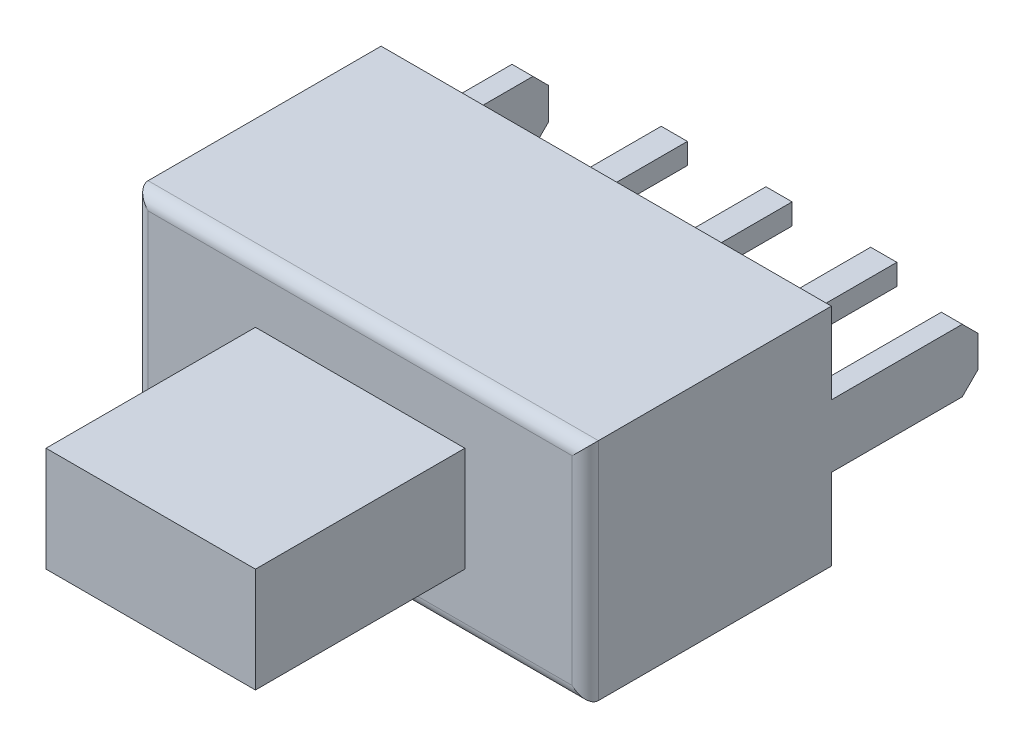
ISO-10303-21;
HEADER;
FILE_DESCRIPTION(('STEP AP214'),'2;1');
FILE_NAME('part.step','',(''),(''),'','','');
FILE_SCHEMA(('AUTOMOTIVE_DESIGN { 1 0 10303 214 1 1 1 1 }'));
ENDSEC;
DATA;
#1=APPLICATION_CONTEXT('core data for automotive mechanical design processes');
#2=APPLICATION_PROTOCOL_DEFINITION('international standard','automotive_design',2000,#1);
#3=PRODUCT_CONTEXT('',#1,'mechanical');
#4=PRODUCT('Part','Part','',(#3));
#5=PRODUCT_RELATED_PRODUCT_CATEGORY('part','',(#4));
#6=PRODUCT_DEFINITION_FORMATION('','',#4);
#7=PRODUCT_DEFINITION_CONTEXT('part definition',#1,'design');
#8=PRODUCT_DEFINITION('design','',#6,#7);
#9=PRODUCT_DEFINITION_SHAPE('','',#8);
#10=(LENGTH_UNIT() NAMED_UNIT(*) SI_UNIT(.MILLI.,.METRE.));
#11=(NAMED_UNIT(*) PLANE_ANGLE_UNIT() SI_UNIT($,.RADIAN.));
#12=(NAMED_UNIT(*) SI_UNIT($,.STERADIAN.) SOLID_ANGLE_UNIT());
#13=UNCERTAINTY_MEASURE_WITH_UNIT(LENGTH_MEASURE(1.E-05),#10,'distance_accuracy_value','');
#14=(GEOMETRIC_REPRESENTATION_CONTEXT(3) GLOBAL_UNCERTAINTY_ASSIGNED_CONTEXT((#13)) GLOBAL_UNIT_ASSIGNED_CONTEXT((#10,
#11,#12)) REPRESENTATION_CONTEXT('',''));
#15=CARTESIAN_POINT('',(0.,0.,0.));
#16=DIRECTION('',(0.,0.,1.));
#17=DIRECTION('',(1.,0.,0.));
#18=AXIS2_PLACEMENT_3D('',#15,#16,#17);
#19=CARTESIAN_POINT('',(0.,0.,4.7));
#20=DIRECTION('',(0.,0.,-1.));
#21=DIRECTION('',(-1.,0.,0.));
#22=AXIS2_PLACEMENT_3D('',#19,#20,#21);
#23=PLANE('',#22);
#24=DIRECTION('',(0.,-1.,0.));
#25=VECTOR('',#24,1.);
#26=CARTESIAN_POINT('',(-4.05,0.,4.7));
#27=LINE('',#26,#25);
#28=CARTESIAN_POINT('',(-4.05,1.9,4.7));
#29=VERTEX_POINT('',#28);
#30=CARTESIAN_POINT('',(-4.05,-1.9,4.7));
#31=VERTEX_POINT('',#30);
#32=EDGE_CURVE('E505',#29,#31,#27,.T.);
#33=ORIENTED_EDGE('',*,*,#32,.T.);
#34=DIRECTION('',(1.,0.,0.));
#35=VECTOR('',#34,1.);
#36=CARTESIAN_POINT('',(0.,-1.9,4.7));
#37=LINE('',#36,#35);
#38=CARTESIAN_POINT('',(4.05,-1.9,4.7));
#39=VERTEX_POINT('',#38);
#40=EDGE_CURVE('E510',#31,#39,#37,.T.);
#41=ORIENTED_EDGE('',*,*,#40,.T.);
#42=DIRECTION('',(0.,1.,0.));
#43=VECTOR('',#42,1.);
#44=CARTESIAN_POINT('',(4.05,0.,4.7));
#45=LINE('',#44,#43);
#46=CARTESIAN_POINT('',(4.05,1.9,4.7));
#47=VERTEX_POINT('',#46);
#48=EDGE_CURVE('E507',#39,#47,#45,.T.);
#49=ORIENTED_EDGE('',*,*,#48,.T.);
#50=DIRECTION('',(-1.,0.,0.));
#51=VECTOR('',#50,1.);
#52=CARTESIAN_POINT('',(0.,1.9,4.7));
#53=LINE('',#52,#51);
#54=EDGE_CURVE('E503',#47,#29,#53,.T.);
#55=ORIENTED_EDGE('',*,*,#54,.T.);
#56=EDGE_LOOP('',(#33,#41,#49,#55));
#57=FACE_BOUND('',#56,.T.);
#58=DIRECTION('',(0.,1.,0.));
#59=VECTOR('',#58,1.);
#60=CARTESIAN_POINT('',(2.,-1.,4.7));
#61=LINE('',#60,#59);
#62=CARTESIAN_POINT('',(2.,-1.,4.7));
#63=VERTEX_POINT('',#62);
#64=CARTESIAN_POINT('',(2.,1.,4.7));
#65=VERTEX_POINT('',#64);
#66=EDGE_CURVE('E412',#63,#65,#61,.T.);
#67=ORIENTED_EDGE('',*,*,#66,.F.);
#68=DIRECTION('',(1.,0.,0.));
#69=VECTOR('',#68,1.);
#70=CARTESIAN_POINT('',(-2.,-1.,4.7));
#71=LINE('',#70,#69);
#72=CARTESIAN_POINT('',(-2.,-1.,4.7));
#73=VERTEX_POINT('',#72);
#74=EDGE_CURVE('E417',#73,#63,#71,.T.);
#75=ORIENTED_EDGE('',*,*,#74,.F.);
#76=DIRECTION('',(0.,-1.,0.));
#77=VECTOR('',#76,1.);
#78=CARTESIAN_POINT('',(-2.,-1.,4.7));
#79=LINE('',#78,#77);
#80=CARTESIAN_POINT('',(-2.,1.,4.7));
#81=VERTEX_POINT('',#80);
#82=EDGE_CURVE('E429',#81,#73,#79,.T.);
#83=ORIENTED_EDGE('',*,*,#82,.F.);
#84=DIRECTION('',(-1.,0.,0.));
#85=VECTOR('',#84,1.);
#86=CARTESIAN_POINT('',(-2.,1.,4.7));
#87=LINE('',#86,#85);
#88=EDGE_CURVE('E426',#65,#81,#87,.T.);
#89=ORIENTED_EDGE('',*,*,#88,.F.);
#90=EDGE_LOOP('',(#67,#75,#83,#89));
#91=FACE_BOUND('',#90,.T.);
#92=ADVANCED_FACE('F39',(#57,#91),#23,.F.);
#93=CARTESIAN_POINT('',(4.3,-2.15,4.7));
#94=DIRECTION('',(-1.,0.,0.));
#95=DIRECTION('',(0.,0.,1.));
#96=AXIS2_PLACEMENT_3D('',#93,#94,#95);
#97=PLANE('',#96);
#98=DIRECTION('',(0.,0.,-1.));
#99=VECTOR('',#98,1.);
#100=CARTESIAN_POINT('',(4.3,2.15,4.7));
#101=LINE('',#100,#99);
#102=CARTESIAN_POINT('',(4.3,2.15,4.45));
#103=VERTEX_POINT('',#102);
#104=CARTESIAN_POINT('',(4.3,2.15,0.));
#105=VERTEX_POINT('',#104);
#106=EDGE_CURVE('E465',#103,#105,#101,.T.);
#107=ORIENTED_EDGE('',*,*,#106,.F.);
#108=DIRECTION('',(0.,1.,0.));
#109=VECTOR('',#108,1.);
#110=CARTESIAN_POINT('',(4.3,-2.15,4.45));
#111=LINE('',#110,#109);
#112=CARTESIAN_POINT('',(4.3,-2.15,4.45));
#113=VERTEX_POINT('',#112);
#114=EDGE_CURVE('E512',#103,#113,#111,.F.);
#115=ORIENTED_EDGE('',*,*,#114,.T.);
#116=DIRECTION('',(0.,0.,-1.));
#117=VECTOR('',#116,1.);
#118=CARTESIAN_POINT('',(4.3,-2.15,4.7));
#119=LINE('',#118,#117);
#120=CARTESIAN_POINT('',(4.3,-2.15,0.));
#121=VERTEX_POINT('',#120);
#122=EDGE_CURVE('E459',#113,#121,#119,.T.);
#123=ORIENTED_EDGE('',*,*,#122,.T.);
#124=DIRECTION('',(0.,1.,0.));
#125=VECTOR('',#124,1.);
#126=CARTESIAN_POINT('',(4.3,-2.15,0.));
#127=LINE('',#126,#125);
#128=CARTESIAN_POINT('',(4.3,-0.6,0.));
#129=VERTEX_POINT('',#128);
#130=EDGE_CURVE('E446',#121,#129,#127,.T.);
#131=ORIENTED_EDGE('',*,*,#130,.T.);
#132=DIRECTION('',(0.,0.,1.));
#133=VECTOR('',#132,1.);
#134=CARTESIAN_POINT('',(4.3,-0.6,-2.8));
#135=LINE('',#134,#133);
#136=CARTESIAN_POINT('',(4.3,-0.6,-2.5));
#137=VERTEX_POINT('',#136);
#138=EDGE_CURVE('E406',#137,#129,#135,.T.);
#139=ORIENTED_EDGE('',*,*,#138,.F.);
#140=DIRECTION('',(0.,0.707106781186547,-0.707106781186547));
#141=VECTOR('',#140,1.);
#142=CARTESIAN_POINT('',(4.3,-0.3,-2.8));
#143=LINE('',#142,#141);
#144=CARTESIAN_POINT('',(4.3,-0.3,-2.8));
#145=VERTEX_POINT('',#144);
#146=EDGE_CURVE('E480',#137,#145,#143,.T.);
#147=ORIENTED_EDGE('',*,*,#146,.T.);
#148=DIRECTION('',(0.,-1.,0.));
#149=VECTOR('',#148,1.);
#150=CARTESIAN_POINT('',(4.3,0.,-2.8));
#151=LINE('',#150,#149);
#152=CARTESIAN_POINT('',(4.3,0.3,-2.8));
#153=VERTEX_POINT('',#152);
#154=EDGE_CURVE('E393',#153,#145,#151,.T.);
#155=ORIENTED_EDGE('',*,*,#154,.F.);
#156=DIRECTION('',(0.,-0.707106781186547,-0.707106781186547));
#157=VECTOR('',#156,1.);
#158=CARTESIAN_POINT('',(4.3,0.6,-2.5));
#159=LINE('',#158,#157);
#160=CARTESIAN_POINT('',(4.3,0.6,-2.5));
#161=VERTEX_POINT('',#160);
#162=EDGE_CURVE('E478',#153,#161,#159,.F.);
#163=ORIENTED_EDGE('',*,*,#162,.T.);
#164=DIRECTION('',(0.,0.,1.));
#165=VECTOR('',#164,1.);
#166=CARTESIAN_POINT('',(4.3,0.6,-2.8));
#167=LINE('',#166,#165);
#168=CARTESIAN_POINT('',(4.3,0.6,0.));
#169=VERTEX_POINT('',#168);
#170=EDGE_CURVE('E408',#161,#169,#167,.T.);
#171=ORIENTED_EDGE('',*,*,#170,.T.);
#172=EDGE_CURVE('E445',#169,#105,#127,.T.);
#173=ORIENTED_EDGE('',*,*,#172,.T.);
#174=EDGE_LOOP('',(#107,#115,#123,#131,#139,#147,#155,#163,#171,#173));
#175=FACE_BOUND('',#174,.T.);
#176=ADVANCED_FACE('F542',(#175),#97,.F.);
#177=CARTESIAN_POINT('',(-4.3,2.15,4.7));
#178=DIRECTION('',(0.,-1.,0.));
#179=DIRECTION('',(0.,0.,-1.));
#180=AXIS2_PLACEMENT_3D('',#177,#178,#179);
#181=PLANE('',#180);
#182=DIRECTION('',(0.,0.,-1.));
#183=VECTOR('',#182,1.);
#184=CARTESIAN_POINT('',(-4.3,2.15,4.7));
#185=LINE('',#184,#183);
#186=CARTESIAN_POINT('',(-4.3,2.15,4.45));
#187=VERTEX_POINT('',#186);
#188=CARTESIAN_POINT('',(-4.3,2.15,0.));
#189=VERTEX_POINT('',#188);
#190=EDGE_CURVE('E463',#187,#189,#185,.T.);
#191=ORIENTED_EDGE('',*,*,#190,.F.);
#192=DIRECTION('',(-1.,0.,0.));
#193=VECTOR('',#192,1.);
#194=CARTESIAN_POINT('',(-4.3,2.15,4.45));
#195=LINE('',#194,#193);
#196=EDGE_CURVE('E11',#187,#103,#195,.F.);
#197=ORIENTED_EDGE('',*,*,#196,.T.);
#198=ORIENTED_EDGE('',*,*,#106,.T.);
#199=DIRECTION('',(-1.,0.,0.));
#200=VECTOR('',#199,1.);
#201=CARTESIAN_POINT('',(-4.3,2.15,0.));
#202=LINE('',#201,#200);
#203=EDGE_CURVE('E449',#105,#189,#202,.T.);
#204=ORIENTED_EDGE('',*,*,#203,.T.);
#205=EDGE_LOOP('',(#191,#197,#198,#204));
#206=FACE_BOUND('',#205,.T.);
#207=ADVANCED_FACE('F538',(#206),#181,.F.);
#208=CARTESIAN_POINT('',(-4.3,-2.15,4.7));
#209=DIRECTION('',(1.,0.,0.));
#210=DIRECTION('',(0.,0.,-1.));
#211=AXIS2_PLACEMENT_3D('',#208,#209,#210);
#212=PLANE('',#211);
#213=DIRECTION('',(0.,0.,-1.));
#214=VECTOR('',#213,1.);
#215=CARTESIAN_POINT('',(-4.3,-2.15,4.7));
#216=LINE('',#215,#214);
#217=CARTESIAN_POINT('',(-4.3,-2.15,4.45));
#218=VERTEX_POINT('',#217);
#219=CARTESIAN_POINT('',(-4.3,-2.15,0.));
#220=VERTEX_POINT('',#219);
#221=EDGE_CURVE('E461',#218,#220,#216,.T.);
#222=ORIENTED_EDGE('',*,*,#221,.F.);
#223=DIRECTION('',(0.,-1.,0.));
#224=VECTOR('',#223,1.);
#225=CARTESIAN_POINT('',(-4.3,-2.15,4.45));
#226=LINE('',#225,#224);
#227=EDGE_CURVE('E56',#218,#187,#226,.F.);
#228=ORIENTED_EDGE('',*,*,#227,.T.);
#229=ORIENTED_EDGE('',*,*,#190,.T.);
#230=DIRECTION('',(0.,-1.,0.));
#231=VECTOR('',#230,1.);
#232=CARTESIAN_POINT('',(-4.3,-2.15,0.));
#233=LINE('',#232,#231);
#234=CARTESIAN_POINT('',(-4.3,0.6,0.));
#235=VERTEX_POINT('',#234);
#236=EDGE_CURVE('E453',#189,#235,#233,.T.);
#237=ORIENTED_EDGE('',*,*,#236,.T.);
#238=DIRECTION('',(0.,0.,1.));
#239=VECTOR('',#238,1.);
#240=CARTESIAN_POINT('',(-4.3,0.6,-2.8));
#241=LINE('',#240,#239);
#242=CARTESIAN_POINT('',(-4.3,0.6,-2.5));
#243=VERTEX_POINT('',#242);
#244=EDGE_CURVE('E374',#243,#235,#241,.T.);
#245=ORIENTED_EDGE('',*,*,#244,.F.);
#246=DIRECTION('',(0.,0.707106781186547,0.707106781186547));
#247=VECTOR('',#246,1.);
#248=CARTESIAN_POINT('',(-4.3,0.6,-2.5));
#249=LINE('',#248,#247);
#250=CARTESIAN_POINT('',(-4.3,0.3,-2.8));
#251=VERTEX_POINT('',#250);
#252=EDGE_CURVE('E487',#243,#251,#249,.F.);
#253=ORIENTED_EDGE('',*,*,#252,.T.);
#254=DIRECTION('',(0.,1.,0.));
#255=VECTOR('',#254,1.);
#256=CARTESIAN_POINT('',(-4.3,0.,-2.8));
#257=LINE('',#256,#255);
#258=CARTESIAN_POINT('',(-4.3,-0.3,-2.8));
#259=VERTEX_POINT('',#258);
#260=EDGE_CURVE('E370',#259,#251,#257,.T.);
#261=ORIENTED_EDGE('',*,*,#260,.F.);
#262=DIRECTION('',(0.,-0.707106781186547,0.707106781186547));
#263=VECTOR('',#262,1.);
#264=CARTESIAN_POINT('',(-4.3,-0.3,-2.8));
#265=LINE('',#264,#263);
#266=CARTESIAN_POINT('',(-4.3,-0.6,-2.5));
#267=VERTEX_POINT('',#266);
#268=EDGE_CURVE('E489',#259,#267,#265,.T.);
#269=ORIENTED_EDGE('',*,*,#268,.T.);
#270=DIRECTION('',(0.,0.,1.));
#271=VECTOR('',#270,1.);
#272=CARTESIAN_POINT('',(-4.3,-0.6,-2.8));
#273=LINE('',#272,#271);
#274=CARTESIAN_POINT('',(-4.3,-0.6,0.));
#275=VERTEX_POINT('',#274);
#276=EDGE_CURVE('E383',#267,#275,#273,.T.);
#277=ORIENTED_EDGE('',*,*,#276,.T.);
#278=EDGE_CURVE('E452',#275,#220,#233,.T.);
#279=ORIENTED_EDGE('',*,*,#278,.T.);
#280=EDGE_LOOP('',(#222,#228,#229,#237,#245,#253,#261,#269,#277,#279));
#281=FACE_BOUND('',#280,.T.);
#282=ADVANCED_FACE('F586',(#281),#212,.F.);
#283=CARTESIAN_POINT('',(-4.3,-2.15,4.7));
#284=DIRECTION('',(0.,1.,0.));
#285=DIRECTION('',(0.,0.,1.));
#286=AXIS2_PLACEMENT_3D('',#283,#284,#285);
#287=PLANE('',#286);
#288=ORIENTED_EDGE('',*,*,#122,.F.);
#289=DIRECTION('',(1.,0.,0.));
#290=VECTOR('',#289,1.);
#291=CARTESIAN_POINT('',(-4.3,-2.15,4.45));
#292=LINE('',#291,#290);
#293=EDGE_CURVE('E48',#113,#218,#292,.F.);
#294=ORIENTED_EDGE('',*,*,#293,.T.);
#295=ORIENTED_EDGE('',*,*,#221,.T.);
#296=DIRECTION('',(1.,0.,0.));
#297=VECTOR('',#296,1.);
#298=CARTESIAN_POINT('',(-4.3,-2.15,0.));
#299=LINE('',#298,#297);
#300=EDGE_CURVE('E456',#220,#121,#299,.T.);
#301=ORIENTED_EDGE('',*,*,#300,.T.);
#302=EDGE_LOOP('',(#288,#294,#295,#301));
#303=FACE_BOUND('',#302,.T.);
#304=ADVANCED_FACE('F582',(#303),#287,.F.);
#305=CARTESIAN_POINT('',(0.,0.,0.));
#306=DIRECTION('',(0.,0.,-1.));
#307=DIRECTION('',(-1.,0.,0.));
#308=AXIS2_PLACEMENT_3D('',#305,#306,#307);
#309=PLANE('',#308);
#310=DIRECTION('',(0.,-1.,0.));
#311=VECTOR('',#310,1.);
#312=CARTESIAN_POINT('',(1.75,0.,0.));
#313=LINE('',#312,#311);
#314=CARTESIAN_POINT('',(1.75,0.2,0.));
#315=VERTEX_POINT('',#314);
#316=CARTESIAN_POINT('',(1.75,-0.2,0.));
#317=VERTEX_POINT('',#316);
#318=EDGE_CURVE('E266',#315,#317,#313,.T.);
#319=ORIENTED_EDGE('',*,*,#318,.T.);
#320=DIRECTION('',(-1.,0.,0.));
#321=VECTOR('',#320,1.);
#322=CARTESIAN_POINT('',(0.,-0.2,0.));
#323=LINE('',#322,#321);
#324=CARTESIAN_POINT('',(2.25,-0.2,0.));
#325=VERTEX_POINT('',#324);
#326=EDGE_CURVE('E281',#325,#317,#323,.T.);
#327=ORIENTED_EDGE('',*,*,#326,.F.);
#328=DIRECTION('',(0.,-1.,0.));
#329=VECTOR('',#328,1.);
#330=CARTESIAN_POINT('',(2.25,0.,0.));
#331=LINE('',#330,#329);
#332=CARTESIAN_POINT('',(2.25,0.2,0.));
#333=VERTEX_POINT('',#332);
#334=EDGE_CURVE('E294',#333,#325,#331,.T.);
#335=ORIENTED_EDGE('',*,*,#334,.F.);
#336=DIRECTION('',(-1.,0.,0.));
#337=VECTOR('',#336,1.);
#338=CARTESIAN_POINT('',(0.,0.2,0.));
#339=LINE('',#338,#337);
#340=EDGE_CURVE('E292',#333,#315,#339,.T.);
#341=ORIENTED_EDGE('',*,*,#340,.T.);
#342=EDGE_LOOP('',(#319,#327,#335,#341));
#343=FACE_BOUND('',#342,.T.);
#344=DIRECTION('',(-1.,0.,0.));
#345=VECTOR('',#344,1.);
#346=CARTESIAN_POINT('',(0.,0.2,0.));
#347=LINE('',#346,#345);
#348=CARTESIAN_POINT('',(0.25,0.2,0.));
#349=VERTEX_POINT('',#348);
#350=CARTESIAN_POINT('',(-0.25,0.2,0.));
#351=VERTEX_POINT('',#350);
#352=EDGE_CURVE('E271',#349,#351,#347,.T.);
#353=ORIENTED_EDGE('',*,*,#352,.T.);
#354=DIRECTION('',(0.,-1.,0.));
#355=VECTOR('',#354,1.);
#356=CARTESIAN_POINT('',(-0.25,0.,0.));
#357=LINE('',#356,#355);
#358=CARTESIAN_POINT('',(-0.25,-0.2,0.));
#359=VERTEX_POINT('',#358);
#360=EDGE_CURVE('E307',#351,#359,#357,.T.);
#361=ORIENTED_EDGE('',*,*,#360,.T.);
#362=DIRECTION('',(-1.,0.,0.));
#363=VECTOR('',#362,1.);
#364=CARTESIAN_POINT('',(0.,-0.2,0.));
#365=LINE('',#364,#363);
#366=CARTESIAN_POINT('',(0.25,-0.2,0.));
#367=VERTEX_POINT('',#366);
#368=EDGE_CURVE('E319',#367,#359,#365,.T.);
#369=ORIENTED_EDGE('',*,*,#368,.F.);
#370=DIRECTION('',(0.,-1.,0.));
#371=VECTOR('',#370,1.);
#372=CARTESIAN_POINT('',(0.25,0.,0.));
#373=LINE('',#372,#371);
#374=EDGE_CURVE('E316',#349,#367,#373,.T.);
#375=ORIENTED_EDGE('',*,*,#374,.F.);
#376=EDGE_LOOP('',(#353,#361,#369,#375));
#377=FACE_BOUND('',#376,.T.);
#378=DIRECTION('',(-1.,0.,0.));
#379=VECTOR('',#378,1.);
#380=CARTESIAN_POINT('',(0.,0.2,0.));
#381=LINE('',#380,#379);
#382=CARTESIAN_POINT('',(-1.75,0.2,0.));
#383=VERTEX_POINT('',#382);
#384=CARTESIAN_POINT('',(-2.25,0.2,0.));
#385=VERTEX_POINT('',#384);
#386=EDGE_CURVE('E334',#383,#385,#381,.T.);
#387=ORIENTED_EDGE('',*,*,#386,.T.);
#388=DIRECTION('',(0.,-1.,0.));
#389=VECTOR('',#388,1.);
#390=CARTESIAN_POINT('',(-2.25,0.,0.));
#391=LINE('',#390,#389);
#392=CARTESIAN_POINT('',(-2.25,-0.2,0.));
#393=VERTEX_POINT('',#392);
#394=EDGE_CURVE('E339',#385,#393,#391,.T.);
#395=ORIENTED_EDGE('',*,*,#394,.T.);
#396=DIRECTION('',(-1.,0.,0.));
#397=VECTOR('',#396,1.);
#398=CARTESIAN_POINT('',(0.,-0.2,0.));
#399=LINE('',#398,#397);
#400=CARTESIAN_POINT('',(-1.75,-0.2,0.));
#401=VERTEX_POINT('',#400);
#402=EDGE_CURVE('E351',#401,#393,#399,.T.);
#403=ORIENTED_EDGE('',*,*,#402,.F.);
#404=DIRECTION('',(0.,-1.,0.));
#405=VECTOR('',#404,1.);
#406=CARTESIAN_POINT('',(-1.75,0.,0.));
#407=LINE('',#406,#405);
#408=EDGE_CURVE('E348',#383,#401,#407,.T.);
#409=ORIENTED_EDGE('',*,*,#408,.F.);
#410=EDGE_LOOP('',(#387,#395,#403,#409));
#411=FACE_BOUND('',#410,.T.);
#412=DIRECTION('',(-1.,0.,0.));
#413=VECTOR('',#412,1.);
#414=CARTESIAN_POINT('',(0.,0.6,0.));
#415=LINE('',#414,#413);
#416=CARTESIAN_POINT('',(-3.9,0.6,0.));
#417=VERTEX_POINT('',#416);
#418=EDGE_CURVE('E366',#417,#235,#415,.T.);
#419=ORIENTED_EDGE('',*,*,#418,.T.);
#420=ORIENTED_EDGE('',*,*,#236,.F.);
#421=ORIENTED_EDGE('',*,*,#203,.F.);
#422=ORIENTED_EDGE('',*,*,#172,.F.);
#423=DIRECTION('',(-1.,0.,0.));
#424=VECTOR('',#423,1.);
#425=CARTESIAN_POINT('',(0.,0.6,0.));
#426=LINE('',#425,#424);
#427=CARTESIAN_POINT('',(3.9,0.6,0.));
#428=VERTEX_POINT('',#427);
#429=EDGE_CURVE('E400',#169,#428,#426,.T.);
#430=ORIENTED_EDGE('',*,*,#429,.T.);
#431=DIRECTION('',(0.,-1.,0.));
#432=VECTOR('',#431,1.);
#433=CARTESIAN_POINT('',(3.9,0.,0.));
#434=LINE('',#433,#432);
#435=CARTESIAN_POINT('',(3.9,-0.6,0.));
#436=VERTEX_POINT('',#435);
#437=EDGE_CURVE('E389',#428,#436,#434,.T.);
#438=ORIENTED_EDGE('',*,*,#437,.T.);
#439=DIRECTION('',(-1.,0.,0.));
#440=VECTOR('',#439,1.);
#441=CARTESIAN_POINT('',(0.,-0.6,0.));
#442=LINE('',#441,#440);
#443=EDGE_CURVE('E394',#129,#436,#442,.T.);
#444=ORIENTED_EDGE('',*,*,#443,.F.);
#445=ORIENTED_EDGE('',*,*,#130,.F.);
#446=ORIENTED_EDGE('',*,*,#300,.F.);
#447=ORIENTED_EDGE('',*,*,#278,.F.);
#448=DIRECTION('',(-1.,0.,0.));
#449=VECTOR('',#448,1.);
#450=CARTESIAN_POINT('',(0.,-0.6,0.));
#451=LINE('',#450,#449);
#452=CARTESIAN_POINT('',(-3.9,-0.6,0.));
#453=VERTEX_POINT('',#452);
#454=EDGE_CURVE('E371',#453,#275,#451,.T.);
#455=ORIENTED_EDGE('',*,*,#454,.F.);
#456=DIRECTION('',(0.,-1.,0.));
#457=VECTOR('',#456,1.);
#458=CARTESIAN_POINT('',(-3.9,0.,0.));
#459=LINE('',#458,#457);
#460=EDGE_CURVE('E377',#417,#453,#459,.T.);
#461=ORIENTED_EDGE('',*,*,#460,.F.);
#462=EDGE_LOOP('',(#419,#420,#421,#422,#430,#438,#444,#445,#446,#447,#455,#461));
#463=FACE_BOUND('',#462,.T.);
#464=ADVANCED_FACE('F576',(#343,#377,#411,#463),#309,.T.);
#465=CARTESIAN_POINT('',(2.,-1.,8.7));
#466=DIRECTION('',(-1.,0.,0.));
#467=DIRECTION('',(0.,0.,1.));
#468=AXIS2_PLACEMENT_3D('',#465,#466,#467);
#469=PLANE('',#468);
#470=ORIENTED_EDGE('',*,*,#66,.T.);
#471=DIRECTION('',(0.,0.,-1.));
#472=VECTOR('',#471,1.);
#473=CARTESIAN_POINT('',(2.,1.,8.7));
#474=LINE('',#473,#472);
#475=CARTESIAN_POINT('',(2.,1.,8.7));
#476=VERTEX_POINT('',#475);
#477=EDGE_CURVE('E442',#476,#65,#474,.T.);
#478=ORIENTED_EDGE('',*,*,#477,.F.);
#479=DIRECTION('',(0.,1.,0.));
#480=VECTOR('',#479,1.);
#481=CARTESIAN_POINT('',(2.,-1.,8.7));
#482=LINE('',#481,#480);
#483=CARTESIAN_POINT('',(2.,-1.,8.7));
#484=VERTEX_POINT('',#483);
#485=EDGE_CURVE('E413',#484,#476,#482,.T.);
#486=ORIENTED_EDGE('',*,*,#485,.F.);
#487=DIRECTION('',(0.,0.,-1.));
#488=VECTOR('',#487,1.);
#489=CARTESIAN_POINT('',(2.,-1.,8.7));
#490=LINE('',#489,#488);
#491=EDGE_CURVE('E423',#484,#63,#490,.T.);
#492=ORIENTED_EDGE('',*,*,#491,.T.);
#493=EDGE_LOOP('',(#470,#478,#486,#492));
#494=FACE_BOUND('',#493,.T.);
#495=ADVANCED_FACE('F560',(#494),#469,.F.);
#496=CARTESIAN_POINT('',(-2.,1.,8.7));
#497=DIRECTION('',(0.,-1.,0.));
#498=DIRECTION('',(0.,0.,-1.));
#499=AXIS2_PLACEMENT_3D('',#496,#497,#498);
#500=PLANE('',#499);
#501=ORIENTED_EDGE('',*,*,#88,.T.);
#502=DIRECTION('',(0.,0.,-1.));
#503=VECTOR('',#502,1.);
#504=CARTESIAN_POINT('',(-2.,1.,8.7));
#505=LINE('',#504,#503);
#506=CARTESIAN_POINT('',(-2.,1.,8.7));
#507=VERTEX_POINT('',#506);
#508=EDGE_CURVE('E439',#507,#81,#505,.T.);
#509=ORIENTED_EDGE('',*,*,#508,.F.);
#510=DIRECTION('',(-1.,0.,0.));
#511=VECTOR('',#510,1.);
#512=CARTESIAN_POINT('',(-2.,1.,8.7));
#513=LINE('',#512,#511);
#514=EDGE_CURVE('E416',#476,#507,#513,.T.);
#515=ORIENTED_EDGE('',*,*,#514,.F.);
#516=ORIENTED_EDGE('',*,*,#477,.T.);
#517=EDGE_LOOP('',(#501,#509,#515,#516));
#518=FACE_BOUND('',#517,.T.);
#519=ADVANCED_FACE('F568',(#518),#500,.F.);
#520=CARTESIAN_POINT('',(-2.,-1.,8.7));
#521=DIRECTION('',(1.,0.,0.));
#522=DIRECTION('',(0.,0.,-1.));
#523=AXIS2_PLACEMENT_3D('',#520,#521,#522);
#524=PLANE('',#523);
#525=ORIENTED_EDGE('',*,*,#82,.T.);
#526=DIRECTION('',(0.,0.,-1.));
#527=VECTOR('',#526,1.);
#528=CARTESIAN_POINT('',(-2.,-1.,8.7));
#529=LINE('',#528,#527);
#530=CARTESIAN_POINT('',(-2.,-1.,8.7));
#531=VERTEX_POINT('',#530);
#532=EDGE_CURVE('E436',#531,#73,#529,.T.);
#533=ORIENTED_EDGE('',*,*,#532,.F.);
#534=DIRECTION('',(0.,-1.,0.));
#535=VECTOR('',#534,1.);
#536=CARTESIAN_POINT('',(-2.,-1.,8.7));
#537=LINE('',#536,#535);
#538=EDGE_CURVE('E419',#507,#531,#537,.T.);
#539=ORIENTED_EDGE('',*,*,#538,.F.);
#540=ORIENTED_EDGE('',*,*,#508,.T.);
#541=EDGE_LOOP('',(#525,#533,#539,#540));
#542=FACE_BOUND('',#541,.T.);
#543=ADVANCED_FACE('F566',(#542),#524,.F.);
#544=CARTESIAN_POINT('',(-2.,-1.,8.7));
#545=DIRECTION('',(0.,1.,0.));
#546=DIRECTION('',(0.,0.,1.));
#547=AXIS2_PLACEMENT_3D('',#544,#545,#546);
#548=PLANE('',#547);
#549=ORIENTED_EDGE('',*,*,#74,.T.);
#550=ORIENTED_EDGE('',*,*,#491,.F.);
#551=DIRECTION('',(1.,0.,0.));
#552=VECTOR('',#551,1.);
#553=CARTESIAN_POINT('',(-2.,-1.,8.7));
#554=LINE('',#553,#552);
#555=EDGE_CURVE('E421',#531,#484,#554,.T.);
#556=ORIENTED_EDGE('',*,*,#555,.F.);
#557=ORIENTED_EDGE('',*,*,#532,.T.);
#558=EDGE_LOOP('',(#549,#550,#556,#557));
#559=FACE_BOUND('',#558,.T.);
#560=ADVANCED_FACE('F556',(#559),#548,.F.);
#561=CARTESIAN_POINT('',(0.,0.,8.7));
#562=DIRECTION('',(0.,0.,-1.));
#563=DIRECTION('',(-1.,0.,0.));
#564=AXIS2_PLACEMENT_3D('',#561,#562,#563);
#565=PLANE('',#564);
#566=ORIENTED_EDGE('',*,*,#485,.T.);
#567=ORIENTED_EDGE('',*,*,#514,.T.);
#568=ORIENTED_EDGE('',*,*,#538,.T.);
#569=ORIENTED_EDGE('',*,*,#555,.T.);
#570=EDGE_LOOP('',(#566,#567,#568,#569));
#571=FACE_BOUND('',#570,.T.);
#572=ADVANCED_FACE('F562',(#571),#565,.F.);
#573=CARTESIAN_POINT('',(3.9,0.,-2.8));
#574=DIRECTION('',(-1.,0.,0.));
#575=DIRECTION('',(0.,0.,1.));
#576=AXIS2_PLACEMENT_3D('',#573,#574,#575);
#577=PLANE('',#576);
#578=DIRECTION('',(0.,-1.,0.));
#579=VECTOR('',#578,1.);
#580=CARTESIAN_POINT('',(3.9,0.,-2.8));
#581=LINE('',#580,#579);
#582=CARTESIAN_POINT('',(3.9,0.3,-2.8));
#583=VERTEX_POINT('',#582);
#584=CARTESIAN_POINT('',(3.9,-0.3,-2.8));
#585=VERTEX_POINT('',#584);
#586=EDGE_CURVE('E390',#583,#585,#581,.T.);
#587=ORIENTED_EDGE('',*,*,#586,.T.);
#588=DIRECTION('',(0.,-0.707106781186548,0.707106781186548));
#589=VECTOR('',#588,1.);
#590=CARTESIAN_POINT('',(3.9,-0.15,-2.95));
#591=LINE('',#590,#589);
#592=CARTESIAN_POINT('',(3.9,-0.6,-2.5));
#593=VERTEX_POINT('',#592);
#594=EDGE_CURVE('E474',#585,#593,#591,.T.);
#595=ORIENTED_EDGE('',*,*,#594,.T.);
#596=DIRECTION('',(0.,0.,1.));
#597=VECTOR('',#596,1.);
#598=CARTESIAN_POINT('',(3.9,-0.6,-2.8));
#599=LINE('',#598,#597);
#600=EDGE_CURVE('E397',#593,#436,#599,.T.);
#601=ORIENTED_EDGE('',*,*,#600,.T.);
#602=ORIENTED_EDGE('',*,*,#437,.F.);
#603=DIRECTION('',(0.,0.,1.));
#604=VECTOR('',#603,1.);
#605=CARTESIAN_POINT('',(3.9,0.6,-2.8));
#606=LINE('',#605,#604);
#607=CARTESIAN_POINT('',(3.9,0.6,-2.5));
#608=VERTEX_POINT('',#607);
#609=EDGE_CURVE('E410',#608,#428,#606,.T.);
#610=ORIENTED_EDGE('',*,*,#609,.F.);
#611=DIRECTION('',(0.,0.707106781186548,0.707106781186548));
#612=VECTOR('',#611,1.);
#613=CARTESIAN_POINT('',(3.9,0.15,-2.95));
#614=LINE('',#613,#612);
#615=EDGE_CURVE('E472',#608,#583,#614,.F.);
#616=ORIENTED_EDGE('',*,*,#615,.T.);
#617=EDGE_LOOP('',(#587,#595,#601,#602,#610,#616));
#618=FACE_BOUND('',#617,.T.);
#619=ADVANCED_FACE('F819',(#618),#577,.T.);
#620=CARTESIAN_POINT('',(0.,0.6,-2.8));
#621=DIRECTION('',(0.,1.,0.));
#622=DIRECTION('',(0.,0.,1.));
#623=AXIS2_PLACEMENT_3D('',#620,#621,#622);
#624=PLANE('',#623);
#625=ORIENTED_EDGE('',*,*,#170,.F.);
#626=DIRECTION('',(-1.,0.,0.));
#627=VECTOR('',#626,1.);
#628=CARTESIAN_POINT('',(0.,0.6,-2.5));
#629=LINE('',#628,#627);
#630=EDGE_CURVE('E497',#161,#608,#629,.T.);
#631=ORIENTED_EDGE('',*,*,#630,.T.);
#632=ORIENTED_EDGE('',*,*,#609,.T.);
#633=ORIENTED_EDGE('',*,*,#429,.F.);
#634=EDGE_LOOP('',(#625,#631,#632,#633));
#635=FACE_BOUND('',#634,.T.);
#636=ADVANCED_FACE('F811',(#635),#624,.T.);
#637=CARTESIAN_POINT('',(0.,-0.6,-2.8));
#638=DIRECTION('',(0.,1.,0.));
#639=DIRECTION('',(0.,0.,1.));
#640=AXIS2_PLACEMENT_3D('',#637,#638,#639);
#641=PLANE('',#640);
#642=ORIENTED_EDGE('',*,*,#600,.F.);
#643=DIRECTION('',(1.,0.,0.));
#644=VECTOR('',#643,1.);
#645=CARTESIAN_POINT('',(4.3,-0.6,-2.5));
#646=LINE('',#645,#644);
#647=EDGE_CURVE('E476',#593,#137,#646,.T.);
#648=ORIENTED_EDGE('',*,*,#647,.T.);
#649=ORIENTED_EDGE('',*,*,#138,.T.);
#650=ORIENTED_EDGE('',*,*,#443,.T.);
#651=EDGE_LOOP('',(#642,#648,#649,#650));
#652=FACE_BOUND('',#651,.T.);
#653=ADVANCED_FACE('F803',(#652),#641,.F.);
#654=CARTESIAN_POINT('',(0.,0.,-2.8));
#655=DIRECTION('',(0.,0.,-1.));
#656=DIRECTION('',(-1.,0.,0.));
#657=AXIS2_PLACEMENT_3D('',#654,#655,#656);
#658=PLANE('',#657);
#659=ORIENTED_EDGE('',*,*,#154,.T.);
#660=DIRECTION('',(-1.,0.,0.));
#661=VECTOR('',#660,1.);
#662=CARTESIAN_POINT('',(3.9,-0.3,-2.8));
#663=LINE('',#662,#661);
#664=EDGE_CURVE('E469',#145,#585,#663,.T.);
#665=ORIENTED_EDGE('',*,*,#664,.T.);
#666=ORIENTED_EDGE('',*,*,#586,.F.);
#667=DIRECTION('',(1.,0.,0.));
#668=VECTOR('',#667,1.);
#669=CARTESIAN_POINT('',(0.,0.3,-2.8));
#670=LINE('',#669,#668);
#671=EDGE_CURVE('E467',#583,#153,#670,.T.);
#672=ORIENTED_EDGE('',*,*,#671,.T.);
#673=EDGE_LOOP('',(#659,#665,#666,#672));
#674=FACE_BOUND('',#673,.T.);
#675=ADVANCED_FACE('F795',(#674),#658,.T.);
#676=CARTESIAN_POINT('',(0.,0.6,-2.8));
#677=DIRECTION('',(0.,1.,0.));
#678=DIRECTION('',(0.,0.,1.));
#679=AXIS2_PLACEMENT_3D('',#676,#677,#678);
#680=PLANE('',#679);
#681=DIRECTION('',(0.,0.,1.));
#682=VECTOR('',#681,1.);
#683=CARTESIAN_POINT('',(-3.9,0.6,-2.8));
#684=LINE('',#683,#682);
#685=CARTESIAN_POINT('',(-3.9,0.6,-2.5));
#686=VERTEX_POINT('',#685);
#687=EDGE_CURVE('E387',#686,#417,#684,.T.);
#688=ORIENTED_EDGE('',*,*,#687,.F.);
#689=DIRECTION('',(-1.,0.,0.));
#690=VECTOR('',#689,1.);
#691=CARTESIAN_POINT('',(0.,0.6,-2.5));
#692=LINE('',#691,#690);
#693=EDGE_CURVE('E500',#686,#243,#692,.T.);
#694=ORIENTED_EDGE('',*,*,#693,.T.);
#695=ORIENTED_EDGE('',*,*,#244,.T.);
#696=ORIENTED_EDGE('',*,*,#418,.F.);
#697=EDGE_LOOP('',(#688,#694,#695,#696));
#698=FACE_BOUND('',#697,.T.);
#699=ADVANCED_FACE('F787',(#698),#680,.T.);
#700=CARTESIAN_POINT('',(-3.9,0.,-2.8));
#701=DIRECTION('',(-1.,0.,0.));
#702=DIRECTION('',(0.,0.,1.));
#703=AXIS2_PLACEMENT_3D('',#700,#701,#702);
#704=PLANE('',#703);
#705=DIRECTION('',(0.,0.,1.));
#706=VECTOR('',#705,1.);
#707=CARTESIAN_POINT('',(-3.9,-0.6,-2.8));
#708=LINE('',#707,#706);
#709=CARTESIAN_POINT('',(-3.9,-0.6,-2.5));
#710=VERTEX_POINT('',#709);
#711=EDGE_CURVE('E385',#710,#453,#708,.T.);
#712=ORIENTED_EDGE('',*,*,#711,.F.);
#713=DIRECTION('',(0.,0.707106781186548,-0.707106781186548));
#714=VECTOR('',#713,1.);
#715=CARTESIAN_POINT('',(-3.9,-0.3,-2.8));
#716=LINE('',#715,#714);
#717=CARTESIAN_POINT('',(-3.9,-0.3,-2.8));
#718=VERTEX_POINT('',#717);
#719=EDGE_CURVE('E495',#710,#718,#716,.T.);
#720=ORIENTED_EDGE('',*,*,#719,.T.);
#721=DIRECTION('',(0.,-1.,0.));
#722=VECTOR('',#721,1.);
#723=CARTESIAN_POINT('',(-3.9,0.,-2.8));
#724=LINE('',#723,#722);
#725=CARTESIAN_POINT('',(-3.9,0.3,-2.8));
#726=VERTEX_POINT('',#725);
#727=EDGE_CURVE('E367',#726,#718,#724,.T.);
#728=ORIENTED_EDGE('',*,*,#727,.F.);
#729=DIRECTION('',(0.,-0.707106781186548,-0.707106781186548));
#730=VECTOR('',#729,1.);
#731=CARTESIAN_POINT('',(-3.9,0.6,-2.5));
#732=LINE('',#731,#730);
#733=EDGE_CURVE('E493',#726,#686,#732,.F.);
#734=ORIENTED_EDGE('',*,*,#733,.T.);
#735=ORIENTED_EDGE('',*,*,#687,.T.);
#736=ORIENTED_EDGE('',*,*,#460,.T.);
#737=EDGE_LOOP('',(#712,#720,#728,#734,#735,#736));
#738=FACE_BOUND('',#737,.T.);
#739=ADVANCED_FACE('F779',(#738),#704,.F.);
#740=CARTESIAN_POINT('',(0.,-0.6,-2.8));
#741=DIRECTION('',(0.,1.,0.));
#742=DIRECTION('',(0.,0.,1.));
#743=AXIS2_PLACEMENT_3D('',#740,#741,#742);
#744=PLANE('',#743);
#745=ORIENTED_EDGE('',*,*,#276,.F.);
#746=DIRECTION('',(1.,0.,0.));
#747=VECTOR('',#746,1.);
#748=CARTESIAN_POINT('',(-3.9,-0.6,-2.5));
#749=LINE('',#748,#747);
#750=EDGE_CURVE('E491',#267,#710,#749,.T.);
#751=ORIENTED_EDGE('',*,*,#750,.T.);
#752=ORIENTED_EDGE('',*,*,#711,.T.);
#753=ORIENTED_EDGE('',*,*,#454,.T.);
#754=EDGE_LOOP('',(#745,#751,#752,#753));
#755=FACE_BOUND('',#754,.T.);
#756=ADVANCED_FACE('F771',(#755),#744,.F.);
#757=CARTESIAN_POINT('',(0.,0.,-2.8));
#758=DIRECTION('',(0.,0.,-1.));
#759=DIRECTION('',(-1.,0.,0.));
#760=AXIS2_PLACEMENT_3D('',#757,#758,#759);
#761=PLANE('',#760);
#762=ORIENTED_EDGE('',*,*,#727,.T.);
#763=DIRECTION('',(-1.,0.,0.));
#764=VECTOR('',#763,1.);
#765=CARTESIAN_POINT('',(-4.3,-0.3,-2.8));
#766=LINE('',#765,#764);
#767=EDGE_CURVE('E484',#718,#259,#766,.T.);
#768=ORIENTED_EDGE('',*,*,#767,.T.);
#769=ORIENTED_EDGE('',*,*,#260,.T.);
#770=DIRECTION('',(1.,0.,0.));
#771=VECTOR('',#770,1.);
#772=CARTESIAN_POINT('',(0.,0.3,-2.8));
#773=LINE('',#772,#771);
#774=EDGE_CURVE('E482',#251,#726,#773,.T.);
#775=ORIENTED_EDGE('',*,*,#774,.T.);
#776=EDGE_LOOP('',(#762,#768,#769,#775));
#777=FACE_BOUND('',#776,.T.);
#778=ADVANCED_FACE('F763',(#777),#761,.T.);
#779=CARTESIAN_POINT('',(0.,0.2,-3.3));
#780=DIRECTION('',(0.,1.,0.));
#781=DIRECTION('',(0.,0.,1.));
#782=AXIS2_PLACEMENT_3D('',#779,#780,#781);
#783=PLANE('',#782);
#784=ORIENTED_EDGE('',*,*,#386,.F.);
#785=DIRECTION('',(0.,0.,1.));
#786=VECTOR('',#785,1.);
#787=CARTESIAN_POINT('',(-1.75,0.2,-3.3));
#788=LINE('',#787,#786);
#789=CARTESIAN_POINT('',(-1.75,0.2,-3.3));
#790=VERTEX_POINT('',#789);
#791=EDGE_CURVE('E363',#790,#383,#788,.T.);
#792=ORIENTED_EDGE('',*,*,#791,.F.);
#793=DIRECTION('',(-1.,0.,0.));
#794=VECTOR('',#793,1.);
#795=CARTESIAN_POINT('',(0.,0.2,-3.3));
#796=LINE('',#795,#794);
#797=CARTESIAN_POINT('',(-2.25,0.2,-3.3));
#798=VERTEX_POINT('',#797);
#799=EDGE_CURVE('E335',#790,#798,#796,.T.);
#800=ORIENTED_EDGE('',*,*,#799,.T.);
#801=DIRECTION('',(0.,0.,1.));
#802=VECTOR('',#801,1.);
#803=CARTESIAN_POINT('',(-2.25,0.2,-3.3));
#804=LINE('',#803,#802);
#805=EDGE_CURVE('E346',#798,#385,#804,.T.);
#806=ORIENTED_EDGE('',*,*,#805,.T.);
#807=EDGE_LOOP('',(#784,#792,#800,#806));
#808=FACE_BOUND('',#807,.T.);
#809=ADVANCED_FACE('F755',(#808),#783,.T.);
#810=CARTESIAN_POINT('',(-1.75,0.,-3.3));
#811=DIRECTION('',(-1.,0.,0.));
#812=DIRECTION('',(0.,0.,1.));
#813=AXIS2_PLACEMENT_3D('',#810,#811,#812);
#814=PLANE('',#813);
#815=ORIENTED_EDGE('',*,*,#408,.T.);
#816=DIRECTION('',(0.,0.,1.));
#817=VECTOR('',#816,1.);
#818=CARTESIAN_POINT('',(-1.75,-0.2,-3.3));
#819=LINE('',#818,#817);
#820=CARTESIAN_POINT('',(-1.75,-0.2,-3.3));
#821=VERTEX_POINT('',#820);
#822=EDGE_CURVE('E360',#821,#401,#819,.T.);
#823=ORIENTED_EDGE('',*,*,#822,.F.);
#824=DIRECTION('',(0.,-1.,0.));
#825=VECTOR('',#824,1.);
#826=CARTESIAN_POINT('',(-1.75,0.,-3.3));
#827=LINE('',#826,#825);
#828=EDGE_CURVE('E338',#790,#821,#827,.T.);
#829=ORIENTED_EDGE('',*,*,#828,.F.);
#830=ORIENTED_EDGE('',*,*,#791,.T.);
#831=EDGE_LOOP('',(#815,#823,#829,#830));
#832=FACE_BOUND('',#831,.T.);
#833=ADVANCED_FACE('F747',(#832),#814,.F.);
#834=CARTESIAN_POINT('',(0.,-0.2,-3.3));
#835=DIRECTION('',(0.,1.,0.));
#836=DIRECTION('',(0.,0.,1.));
#837=AXIS2_PLACEMENT_3D('',#834,#835,#836);
#838=PLANE('',#837);
#839=ORIENTED_EDGE('',*,*,#402,.T.);
#840=DIRECTION('',(0.,0.,1.));
#841=VECTOR('',#840,1.);
#842=CARTESIAN_POINT('',(-2.25,-0.2,-3.3));
#843=LINE('',#842,#841);
#844=CARTESIAN_POINT('',(-2.25,-0.2,-3.3));
#845=VERTEX_POINT('',#844);
#846=EDGE_CURVE('E357',#845,#393,#843,.T.);
#847=ORIENTED_EDGE('',*,*,#846,.F.);
#848=DIRECTION('',(-1.,0.,0.));
#849=VECTOR('',#848,1.);
#850=CARTESIAN_POINT('',(0.,-0.2,-3.3));
#851=LINE('',#850,#849);
#852=EDGE_CURVE('E341',#821,#845,#851,.T.);
#853=ORIENTED_EDGE('',*,*,#852,.F.);
#854=ORIENTED_EDGE('',*,*,#822,.T.);
#855=EDGE_LOOP('',(#839,#847,#853,#854));
#856=FACE_BOUND('',#855,.T.);
#857=ADVANCED_FACE('F739',(#856),#838,.F.);
#858=CARTESIAN_POINT('',(-2.25,0.,-3.3));
#859=DIRECTION('',(-1.,0.,0.));
#860=DIRECTION('',(0.,0.,1.));
#861=AXIS2_PLACEMENT_3D('',#858,#859,#860);
#862=PLANE('',#861);
#863=ORIENTED_EDGE('',*,*,#394,.F.);
#864=ORIENTED_EDGE('',*,*,#805,.F.);
#865=DIRECTION('',(0.,-1.,0.));
#866=VECTOR('',#865,1.);
#867=CARTESIAN_POINT('',(-2.25,0.,-3.3));
#868=LINE('',#867,#866);
#869=EDGE_CURVE('E343',#798,#845,#868,.T.);
#870=ORIENTED_EDGE('',*,*,#869,.T.);
#871=ORIENTED_EDGE('',*,*,#846,.T.);
#872=EDGE_LOOP('',(#863,#864,#870,#871));
#873=FACE_BOUND('',#872,.T.);
#874=ADVANCED_FACE('F731',(#873),#862,.T.);
#875=CARTESIAN_POINT('',(0.,0.,-3.3));
#876=DIRECTION('',(0.,0.,-1.));
#877=DIRECTION('',(-1.,0.,0.));
#878=AXIS2_PLACEMENT_3D('',#875,#876,#877);
#879=PLANE('',#878);
#880=ORIENTED_EDGE('',*,*,#799,.F.);
#881=ORIENTED_EDGE('',*,*,#828,.T.);
#882=ORIENTED_EDGE('',*,*,#852,.T.);
#883=ORIENTED_EDGE('',*,*,#869,.F.);
#884=EDGE_LOOP('',(#880,#881,#882,#883));
#885=FACE_BOUND('',#884,.T.);
#886=ADVANCED_FACE('F723',(#885),#879,.T.);
#887=CARTESIAN_POINT('',(0.,0.2,-3.3));
#888=DIRECTION('',(0.,1.,0.));
#889=DIRECTION('',(0.,0.,1.));
#890=AXIS2_PLACEMENT_3D('',#887,#888,#889);
#891=PLANE('',#890);
#892=ORIENTED_EDGE('',*,*,#352,.F.);
#893=DIRECTION('',(0.,0.,1.));
#894=VECTOR('',#893,1.);
#895=CARTESIAN_POINT('',(0.25,0.2,-3.3));
#896=LINE('',#895,#894);
#897=CARTESIAN_POINT('',(0.25,0.2,-3.3));
#898=VERTEX_POINT('',#897);
#899=EDGE_CURVE('E331',#898,#349,#896,.T.);
#900=ORIENTED_EDGE('',*,*,#899,.F.);
#901=DIRECTION('',(-1.,0.,0.));
#902=VECTOR('',#901,1.);
#903=CARTESIAN_POINT('',(0.,0.2,-3.3));
#904=LINE('',#903,#902);
#905=CARTESIAN_POINT('',(-0.25,0.2,-3.3));
#906=VERTEX_POINT('',#905);
#907=EDGE_CURVE('E303',#898,#906,#904,.T.);
#908=ORIENTED_EDGE('',*,*,#907,.T.);
#909=DIRECTION('',(0.,0.,1.));
#910=VECTOR('',#909,1.);
#911=CARTESIAN_POINT('',(-0.25,0.2,-3.3));
#912=LINE('',#911,#910);
#913=EDGE_CURVE('E314',#906,#351,#912,.T.);
#914=ORIENTED_EDGE('',*,*,#913,.T.);
#915=EDGE_LOOP('',(#892,#900,#908,#914));
#916=FACE_BOUND('',#915,.T.);
#917=ADVANCED_FACE('F715',(#916),#891,.T.);
#918=CARTESIAN_POINT('',(0.25,0.,-3.3));
#919=DIRECTION('',(-1.,0.,0.));
#920=DIRECTION('',(0.,0.,1.));
#921=AXIS2_PLACEMENT_3D('',#918,#919,#920);
#922=PLANE('',#921);
#923=ORIENTED_EDGE('',*,*,#374,.T.);
#924=DIRECTION('',(0.,0.,1.));
#925=VECTOR('',#924,1.);
#926=CARTESIAN_POINT('',(0.25,-0.2,-3.3));
#927=LINE('',#926,#925);
#928=CARTESIAN_POINT('',(0.25,-0.2,-3.3));
#929=VERTEX_POINT('',#928);
#930=EDGE_CURVE('E328',#929,#367,#927,.T.);
#931=ORIENTED_EDGE('',*,*,#930,.F.);
#932=DIRECTION('',(0.,-1.,0.));
#933=VECTOR('',#932,1.);
#934=CARTESIAN_POINT('',(0.25,0.,-3.3));
#935=LINE('',#934,#933);
#936=EDGE_CURVE('E306',#898,#929,#935,.T.);
#937=ORIENTED_EDGE('',*,*,#936,.F.);
#938=ORIENTED_EDGE('',*,*,#899,.T.);
#939=EDGE_LOOP('',(#923,#931,#937,#938));
#940=FACE_BOUND('',#939,.T.);
#941=ADVANCED_FACE('F707',(#940),#922,.F.);
#942=CARTESIAN_POINT('',(0.,-0.2,-3.3));
#943=DIRECTION('',(0.,1.,0.));
#944=DIRECTION('',(0.,0.,1.));
#945=AXIS2_PLACEMENT_3D('',#942,#943,#944);
#946=PLANE('',#945);
#947=ORIENTED_EDGE('',*,*,#368,.T.);
#948=DIRECTION('',(0.,0.,1.));
#949=VECTOR('',#948,1.);
#950=CARTESIAN_POINT('',(-0.25,-0.2,-3.3));
#951=LINE('',#950,#949);
#952=CARTESIAN_POINT('',(-0.25,-0.2,-3.3));
#953=VERTEX_POINT('',#952);
#954=EDGE_CURVE('E325',#953,#359,#951,.T.);
#955=ORIENTED_EDGE('',*,*,#954,.F.);
#956=DIRECTION('',(-1.,0.,0.));
#957=VECTOR('',#956,1.);
#958=CARTESIAN_POINT('',(0.,-0.2,-3.3));
#959=LINE('',#958,#957);
#960=EDGE_CURVE('E309',#929,#953,#959,.T.);
#961=ORIENTED_EDGE('',*,*,#960,.F.);
#962=ORIENTED_EDGE('',*,*,#930,.T.);
#963=EDGE_LOOP('',(#947,#955,#961,#962));
#964=FACE_BOUND('',#963,.T.);
#965=ADVANCED_FACE('F699',(#964),#946,.F.);
#966=CARTESIAN_POINT('',(-0.25,0.,-3.3));
#967=DIRECTION('',(-1.,0.,0.));
#968=DIRECTION('',(0.,-1.,0.));
#969=AXIS2_PLACEMENT_3D('',#966,#967,#968);
#970=PLANE('',#969);
#971=ORIENTED_EDGE('',*,*,#360,.F.);
#972=ORIENTED_EDGE('',*,*,#913,.F.);
#973=DIRECTION('',(0.,-1.,0.));
#974=VECTOR('',#973,1.);
#975=CARTESIAN_POINT('',(-0.25,0.,-3.3));
#976=LINE('',#975,#974);
#977=EDGE_CURVE('E311',#906,#953,#976,.T.);
#978=ORIENTED_EDGE('',*,*,#977,.T.);
#979=ORIENTED_EDGE('',*,*,#954,.T.);
#980=EDGE_LOOP('',(#971,#972,#978,#979));
#981=FACE_BOUND('',#980,.T.);
#982=ADVANCED_FACE('F691',(#981),#970,.T.);
#983=CARTESIAN_POINT('',(0.,0.,-3.3));
#984=DIRECTION('',(0.,0.,-1.));
#985=DIRECTION('',(-1.,0.,0.));
#986=AXIS2_PLACEMENT_3D('',#983,#984,#985);
#987=PLANE('',#986);
#988=ORIENTED_EDGE('',*,*,#907,.F.);
#989=ORIENTED_EDGE('',*,*,#936,.T.);
#990=ORIENTED_EDGE('',*,*,#960,.T.);
#991=ORIENTED_EDGE('',*,*,#977,.F.);
#992=EDGE_LOOP('',(#988,#989,#990,#991));
#993=FACE_BOUND('',#992,.T.);
#994=ADVANCED_FACE('F684',(#993),#987,.T.);
#995=CARTESIAN_POINT('',(1.75,0.,-3.3));
#996=DIRECTION('',(-1.,0.,0.));
#997=DIRECTION('',(0.,0.,1.));
#998=AXIS2_PLACEMENT_3D('',#995,#996,#997);
#999=PLANE('',#998);
#1000=ORIENTED_EDGE('',*,*,#318,.F.);
#1001=DIRECTION('',(0.,0.,1.));
#1002=VECTOR('',#1001,1.);
#1003=CARTESIAN_POINT('',(1.75,0.2,-3.3));
#1004=LINE('',#1003,#1002);
#1005=CARTESIAN_POINT('',(1.75,0.2,-3.3));
#1006=VERTEX_POINT('',#1005);
#1007=EDGE_CURVE('E261',#1006,#315,#1004,.T.);
#1008=ORIENTED_EDGE('',*,*,#1007,.F.);
#1009=DIRECTION('',(0.,-1.,0.));
#1010=VECTOR('',#1009,1.);
#1011=CARTESIAN_POINT('',(1.75,0.,-3.3));
#1012=LINE('',#1011,#1010);
#1013=CARTESIAN_POINT('',(1.75,-0.2,-3.3));
#1014=VERTEX_POINT('',#1013);
#1015=EDGE_CURVE('E264',#1006,#1014,#1012,.T.);
#1016=ORIENTED_EDGE('',*,*,#1015,.T.);
#1017=DIRECTION('',(0.,0.,1.));
#1018=VECTOR('',#1017,1.);
#1019=CARTESIAN_POINT('',(1.75,-0.2,-3.3));
#1020=LINE('',#1019,#1018);
#1021=EDGE_CURVE('E290',#1014,#317,#1020,.T.);
#1022=ORIENTED_EDGE('',*,*,#1021,.T.);
#1023=EDGE_LOOP('',(#1000,#1008,#1016,#1022));
#1024=FACE_BOUND('',#1023,.T.);
#1025=ADVANCED_FACE('F263',(#1024),#999,.T.);
#1026=CARTESIAN_POINT('',(0.,0.2,-3.3));
#1027=DIRECTION('',(0.,1.,0.));
#1028=DIRECTION('',(0.,0.,1.));
#1029=AXIS2_PLACEMENT_3D('',#1026,#1027,#1028);
#1030=PLANE('',#1029);
#1031=ORIENTED_EDGE('',*,*,#340,.F.);
#1032=DIRECTION('',(0.,0.,1.));
#1033=VECTOR('',#1032,1.);
#1034=CARTESIAN_POINT('',(2.25,0.2,-3.3));
#1035=LINE('',#1034,#1033);
#1036=CARTESIAN_POINT('',(2.25,0.2,-3.3));
#1037=VERTEX_POINT('',#1036);
#1038=EDGE_CURVE('E272',#1037,#333,#1035,.T.);
#1039=ORIENTED_EDGE('',*,*,#1038,.F.);
#1040=DIRECTION('',(-1.,0.,0.));
#1041=VECTOR('',#1040,1.);
#1042=CARTESIAN_POINT('',(0.,0.2,-3.3));
#1043=LINE('',#1042,#1041);
#1044=EDGE_CURVE('E277',#1037,#1006,#1043,.T.);
#1045=ORIENTED_EDGE('',*,*,#1044,.T.);
#1046=ORIENTED_EDGE('',*,*,#1007,.T.);
#1047=EDGE_LOOP('',(#1031,#1039,#1045,#1046));
#1048=FACE_BOUND('',#1047,.T.);
#1049=ADVANCED_FACE('F283',(#1048),#1030,.T.);
#1050=CARTESIAN_POINT('',(2.25,0.,-3.3));
#1051=DIRECTION('',(-1.,0.,0.));
#1052=DIRECTION('',(0.,0.,1.));
#1053=AXIS2_PLACEMENT_3D('',#1050,#1051,#1052);
#1054=PLANE('',#1053);
#1055=ORIENTED_EDGE('',*,*,#334,.T.);
#1056=DIRECTION('',(0.,0.,1.));
#1057=VECTOR('',#1056,1.);
#1058=CARTESIAN_POINT('',(2.25,-0.2,-3.3));
#1059=LINE('',#1058,#1057);
#1060=CARTESIAN_POINT('',(2.25,-0.2,-3.3));
#1061=VERTEX_POINT('',#1060);
#1062=EDGE_CURVE('E300',#1061,#325,#1059,.T.);
#1063=ORIENTED_EDGE('',*,*,#1062,.F.);
#1064=DIRECTION('',(0.,-1.,0.));
#1065=VECTOR('',#1064,1.);
#1066=CARTESIAN_POINT('',(2.25,0.,-3.3));
#1067=LINE('',#1066,#1065);
#1068=EDGE_CURVE('E285',#1037,#1061,#1067,.T.);
#1069=ORIENTED_EDGE('',*,*,#1068,.F.);
#1070=ORIENTED_EDGE('',*,*,#1038,.T.);
#1071=EDGE_LOOP('',(#1055,#1063,#1069,#1070));
#1072=FACE_BOUND('',#1071,.T.);
#1073=ADVANCED_FACE('F663',(#1072),#1054,.F.);
#1074=CARTESIAN_POINT('',(0.,-0.2,-3.3));
#1075=DIRECTION('',(0.,1.,0.));
#1076=DIRECTION('',(0.,0.,1.));
#1077=AXIS2_PLACEMENT_3D('',#1074,#1075,#1076);
#1078=PLANE('',#1077);
#1079=ORIENTED_EDGE('',*,*,#326,.T.);
#1080=ORIENTED_EDGE('',*,*,#1021,.F.);
#1081=DIRECTION('',(-1.,0.,0.));
#1082=VECTOR('',#1081,1.);
#1083=CARTESIAN_POINT('',(0.,-0.2,-3.3));
#1084=LINE('',#1083,#1082);
#1085=EDGE_CURVE('E279',#1061,#1014,#1084,.T.);
#1086=ORIENTED_EDGE('',*,*,#1085,.F.);
#1087=ORIENTED_EDGE('',*,*,#1062,.T.);
#1088=EDGE_LOOP('',(#1079,#1080,#1086,#1087));
#1089=FACE_BOUND('',#1088,.T.);
#1090=ADVANCED_FACE('F655',(#1089),#1078,.F.);
#1091=CARTESIAN_POINT('',(0.,0.,-3.3));
#1092=DIRECTION('',(0.,0.,-1.));
#1093=DIRECTION('',(-1.,0.,0.));
#1094=AXIS2_PLACEMENT_3D('',#1091,#1092,#1093);
#1095=PLANE('',#1094);
#1096=ORIENTED_EDGE('',*,*,#1015,.F.);
#1097=ORIENTED_EDGE('',*,*,#1044,.F.);
#1098=ORIENTED_EDGE('',*,*,#1068,.T.);
#1099=ORIENTED_EDGE('',*,*,#1085,.T.);
#1100=EDGE_LOOP('',(#1096,#1097,#1098,#1099));
#1101=FACE_BOUND('',#1100,.T.);
#1102=ADVANCED_FACE('F276',(#1101),#1095,.T.);
#1103=CARTESIAN_POINT('',(0.,-0.3,-2.8));
#1104=DIRECTION('',(0.,-0.707106781186547,-0.707106781186547));
#1105=DIRECTION('',(1.,0.,0.));
#1106=AXIS2_PLACEMENT_3D('',#1103,#1104,#1105);
#1107=PLANE('',#1106);
#1108=ORIENTED_EDGE('',*,*,#146,.F.);
#1109=ORIENTED_EDGE('',*,*,#647,.F.);
#1110=ORIENTED_EDGE('',*,*,#594,.F.);
#1111=ORIENTED_EDGE('',*,*,#664,.F.);
#1112=EDGE_LOOP('',(#1108,#1109,#1110,#1111));
#1113=FACE_BOUND('',#1112,.T.);
#1114=ADVANCED_FACE('F594',(#1113),#1107,.T.);
#1115=CARTESIAN_POINT('',(0.,-0.3,-2.8));
#1116=DIRECTION('',(0.,-0.707106781186547,-0.707106781186547));
#1117=DIRECTION('',(1.,0.,0.));
#1118=AXIS2_PLACEMENT_3D('',#1115,#1116,#1117);
#1119=PLANE('',#1118);
#1120=ORIENTED_EDGE('',*,*,#719,.F.);
#1121=ORIENTED_EDGE('',*,*,#750,.F.);
#1122=ORIENTED_EDGE('',*,*,#268,.F.);
#1123=ORIENTED_EDGE('',*,*,#767,.F.);
#1124=EDGE_LOOP('',(#1120,#1121,#1122,#1123));
#1125=FACE_BOUND('',#1124,.T.);
#1126=ADVANCED_FACE('F600',(#1125),#1119,.T.);
#1127=CARTESIAN_POINT('',(0.,0.6,-2.5));
#1128=DIRECTION('',(0.,-0.707106781186547,0.707106781186547));
#1129=DIRECTION('',(-1.,0.,0.));
#1130=AXIS2_PLACEMENT_3D('',#1127,#1128,#1129);
#1131=PLANE('',#1130);
#1132=ORIENTED_EDGE('',*,*,#162,.F.);
#1133=ORIENTED_EDGE('',*,*,#671,.F.);
#1134=ORIENTED_EDGE('',*,*,#615,.F.);
#1135=ORIENTED_EDGE('',*,*,#630,.F.);
#1136=EDGE_LOOP('',(#1132,#1133,#1134,#1135));
#1137=FACE_BOUND('',#1136,.T.);
#1138=ADVANCED_FACE('F607',(#1137),#1131,.F.);
#1139=CARTESIAN_POINT('',(0.,0.6,-2.5));
#1140=DIRECTION('',(0.,-0.707106781186547,0.707106781186547));
#1141=DIRECTION('',(-1.,0.,0.));
#1142=AXIS2_PLACEMENT_3D('',#1139,#1140,#1141);
#1143=PLANE('',#1142);
#1144=ORIENTED_EDGE('',*,*,#733,.F.);
#1145=ORIENTED_EDGE('',*,*,#774,.F.);
#1146=ORIENTED_EDGE('',*,*,#252,.F.);
#1147=ORIENTED_EDGE('',*,*,#693,.F.);
#1148=EDGE_LOOP('',(#1144,#1145,#1146,#1147));
#1149=FACE_BOUND('',#1148,.T.);
#1150=ADVANCED_FACE('F614',(#1149),#1143,.F.);
#1151=CARTESIAN_POINT('',(-4.05,0.,4.45));
#1152=DIRECTION('',(0.,-1.,0.));
#1153=DIRECTION('',(0.,0.,-1.));
#1154=AXIS2_PLACEMENT_3D('',#1151,#1152,#1153);
#1155=CYLINDRICAL_SURFACE('',#1154,0.25);
#1156=CARTESIAN_POINT('',(-4.05,1.9,4.45));
#1157=DIRECTION('',(-0.707106781186547,-0.707106781186547,0.));
#1158=DIRECTION('',(-0.707106781186547,0.707106781186547,0.));
#1159=AXIS2_PLACEMENT_3D('',#1156,#1157,#1158);
#1160=ELLIPSE('',#1159,0.353553390593274,0.25);
#1161=EDGE_CURVE('E520',#187,#29,#1160,.F.);
#1162=ORIENTED_EDGE('',*,*,#1161,.F.);
#1163=ORIENTED_EDGE('',*,*,#227,.F.);
#1164=CARTESIAN_POINT('',(-4.05,-1.9,4.45));
#1165=DIRECTION('',(0.707106781186547,-0.707106781186547,0.));
#1166=DIRECTION('',(0.707106781186547,0.707106781186547,0.));
#1167=AXIS2_PLACEMENT_3D('',#1164,#1165,#1166);
#1168=ELLIPSE('',#1167,0.353553390593274,0.25);
#1169=EDGE_CURVE('E43',#31,#218,#1168,.T.);
#1170=ORIENTED_EDGE('',*,*,#1169,.F.);
#1171=ORIENTED_EDGE('',*,*,#32,.F.);
#1172=EDGE_LOOP('',(#1162,#1163,#1170,#1171));
#1173=FACE_BOUND('',#1172,.T.);
#1174=ADVANCED_FACE('F41',(#1173),#1155,.T.);
#1175=CARTESIAN_POINT('',(0.,-1.9,4.45));
#1176=DIRECTION('',(1.,0.,0.));
#1177=DIRECTION('',(0.,0.,-1.));
#1178=AXIS2_PLACEMENT_3D('',#1175,#1176,#1177);
#1179=CYLINDRICAL_SURFACE('',#1178,0.25);
#1180=ORIENTED_EDGE('',*,*,#1169,.T.);
#1181=ORIENTED_EDGE('',*,*,#293,.F.);
#1182=CARTESIAN_POINT('',(4.05,-1.9,4.45));
#1183=DIRECTION('',(0.707106781186547,0.707106781186547,0.));
#1184=DIRECTION('',(0.707106781186547,-0.707106781186547,0.));
#1185=AXIS2_PLACEMENT_3D('',#1182,#1183,#1184);
#1186=ELLIPSE('',#1185,0.353553390593274,0.25);
#1187=EDGE_CURVE('E519',#39,#113,#1186,.T.);
#1188=ORIENTED_EDGE('',*,*,#1187,.F.);
#1189=ORIENTED_EDGE('',*,*,#40,.F.);
#1190=EDGE_LOOP('',(#1180,#1181,#1188,#1189));
#1191=FACE_BOUND('',#1190,.T.);
#1192=ADVANCED_FACE('F530',(#1191),#1179,.T.);
#1193=CARTESIAN_POINT('',(0.,1.9,4.45));
#1194=DIRECTION('',(-1.,0.,0.));
#1195=DIRECTION('',(0.,0.,1.));
#1196=AXIS2_PLACEMENT_3D('',#1193,#1194,#1195);
#1197=CYLINDRICAL_SURFACE('',#1196,0.25);
#1198=ORIENTED_EDGE('',*,*,#1161,.T.);
#1199=ORIENTED_EDGE('',*,*,#54,.F.);
#1200=CARTESIAN_POINT('',(4.05,1.9,4.45));
#1201=DIRECTION('',(-0.707106781186547,0.707106781186547,0.));
#1202=DIRECTION('',(-0.707106781186547,-0.707106781186547,0.));
#1203=AXIS2_PLACEMENT_3D('',#1200,#1201,#1202);
#1204=ELLIPSE('',#1203,0.353553390593274,0.25);
#1205=EDGE_CURVE('E517',#103,#47,#1204,.F.);
#1206=ORIENTED_EDGE('',*,*,#1205,.F.);
#1207=ORIENTED_EDGE('',*,*,#196,.F.);
#1208=EDGE_LOOP('',(#1198,#1199,#1206,#1207));
#1209=FACE_BOUND('',#1208,.T.);
#1210=ADVANCED_FACE('F535',(#1209),#1197,.T.);
#1211=CARTESIAN_POINT('',(4.05,0.,4.45));
#1212=DIRECTION('',(0.,1.,0.));
#1213=DIRECTION('',(0.,0.,1.));
#1214=AXIS2_PLACEMENT_3D('',#1211,#1212,#1213);
#1215=CYLINDRICAL_SURFACE('',#1214,0.25);
#1216=ORIENTED_EDGE('',*,*,#1187,.T.);
#1217=ORIENTED_EDGE('',*,*,#114,.F.);
#1218=ORIENTED_EDGE('',*,*,#1205,.T.);
#1219=ORIENTED_EDGE('',*,*,#48,.F.);
#1220=EDGE_LOOP('',(#1216,#1217,#1218,#1219));
#1221=FACE_BOUND('',#1220,.T.);
#1222=ADVANCED_FACE('F546',(#1221),#1215,.T.);
#1223=CLOSED_SHELL('',(#92,#176,#207,#282,#304,#464,#495,#519,#543,#560,#572,#619,#636,#653,
#675,#699,#739,#756,#778,#809,#833,#857,#874,#886,#917,#941,#965,#982,#994,#1025,#1049,#1073,
#1090,#1102,#1114,#1126,#1138,#1150,#1174,#1192,#1210,#1222));
#1224=MANIFOLD_SOLID_BREP('B2',#1223);
#1225=ADVANCED_BREP_SHAPE_REPRESENTATION('',(#18,#1224),#14);
#1226=SHAPE_DEFINITION_REPRESENTATION(#9,#1225);
ENDSEC;
END-ISO-10303-21;
